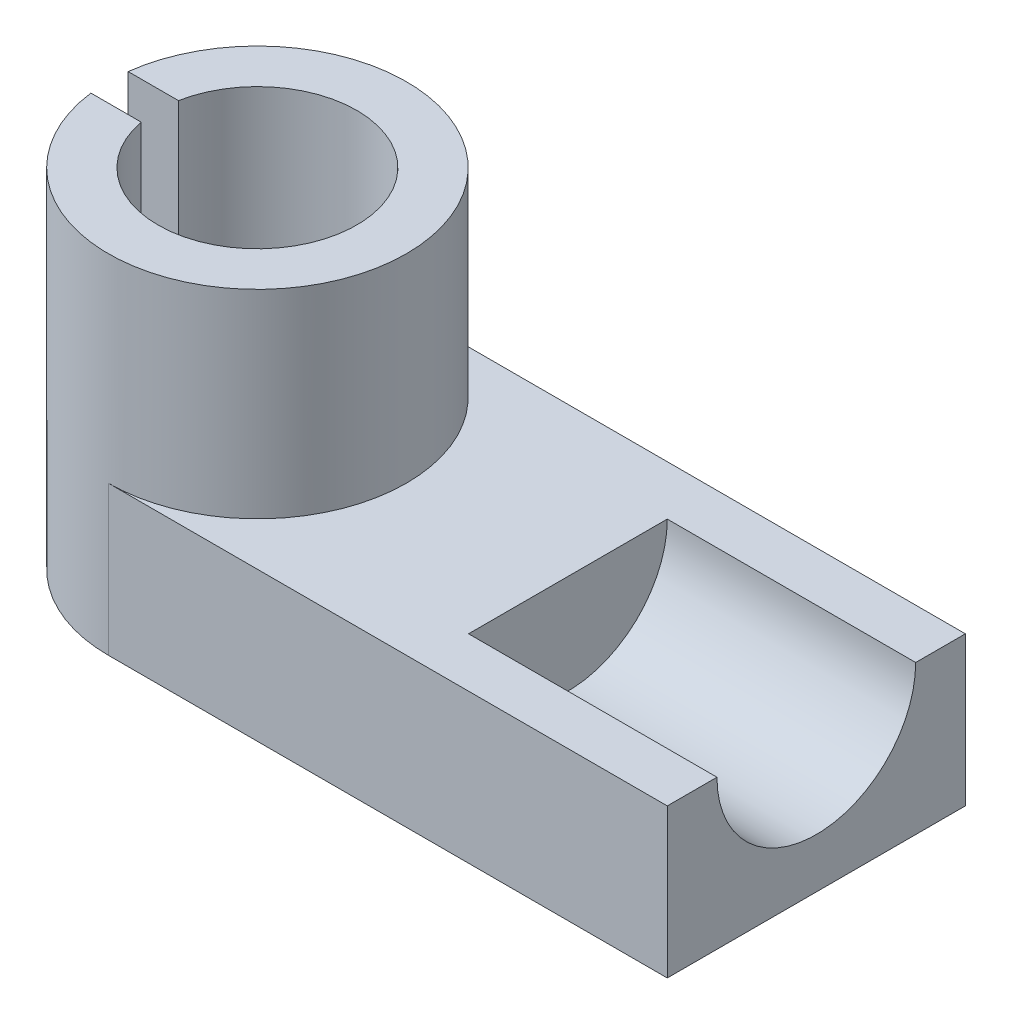
ISO-10303-21;
HEADER;
FILE_DESCRIPTION(('STEP AP214'),'2;1');
FILE_NAME('part.step','',(''),(''),'','','');
FILE_SCHEMA(('AUTOMOTIVE_DESIGN { 1 0 10303 214 1 1 1 1 }'));
ENDSEC;
DATA;
#1=APPLICATION_CONTEXT('core data for automotive mechanical design processes');
#2=APPLICATION_PROTOCOL_DEFINITION('international standard','automotive_design',2000,#1);
#3=PRODUCT_CONTEXT('',#1,'mechanical');
#4=PRODUCT('Part','Part','',(#3));
#5=PRODUCT_RELATED_PRODUCT_CATEGORY('part','',(#4));
#6=PRODUCT_DEFINITION_FORMATION('','',#4);
#7=PRODUCT_DEFINITION_CONTEXT('part definition',#1,'design');
#8=PRODUCT_DEFINITION('design','',#6,#7);
#9=PRODUCT_DEFINITION_SHAPE('','',#8);
#10=(LENGTH_UNIT() NAMED_UNIT(*) SI_UNIT(.MILLI.,.METRE.));
#11=(NAMED_UNIT(*) PLANE_ANGLE_UNIT() SI_UNIT($,.RADIAN.));
#12=(NAMED_UNIT(*) SI_UNIT($,.STERADIAN.) SOLID_ANGLE_UNIT());
#13=UNCERTAINTY_MEASURE_WITH_UNIT(LENGTH_MEASURE(1.E-05),#10,'distance_accuracy_value','');
#14=(GEOMETRIC_REPRESENTATION_CONTEXT(3) GLOBAL_UNCERTAINTY_ASSIGNED_CONTEXT((#13)) GLOBAL_UNIT_ASSIGNED_CONTEXT((#10,
#11,#12)) REPRESENTATION_CONTEXT('',''));
#15=CARTESIAN_POINT('',(0.,0.,0.));
#16=DIRECTION('',(0.,0.,1.));
#17=DIRECTION('',(1.,0.,0.));
#18=AXIS2_PLACEMENT_3D('',#15,#16,#17);
#19=CARTESIAN_POINT('',(0.,0.,0.));
#20=DIRECTION('',(0.,-1.,0.));
#21=DIRECTION('',(0.,0.,-1.));
#22=AXIS2_PLACEMENT_3D('',#19,#20,#21);
#23=PLANE('',#22);
#24=DIRECTION('',(1.,0.,0.));
#25=VECTOR('',#24,1.);
#26=CARTESIAN_POINT('',(-80.,0.,3.));
#27=LINE('',#26,#25);
#28=CARTESIAN_POINT('',(-68.8117617995813,0.,3.));
#29=VERTEX_POINT('',#28);
#30=CARTESIAN_POINT('',(-60.7162336455017,0.,3.));
#31=VERTEX_POINT('',#30);
#32=EDGE_CURVE('E300',#29,#31,#27,.T.);
#33=ORIENTED_EDGE('',*,*,#32,.T.);
#34=CARTESIAN_POINT('',(-45.,0.,0.));
#35=DIRECTION('',(0.,1.,0.));
#36=DIRECTION('',(0.,0.,1.));
#37=AXIS2_PLACEMENT_3D('',#34,#35,#36);
#38=CIRCLE('',#37,16.);
#39=CARTESIAN_POINT('',(-60.7162336455017,0.,-3.));
#40=VERTEX_POINT('',#39);
#41=EDGE_CURVE('E293',#31,#40,#38,.T.);
#42=ORIENTED_EDGE('',*,*,#41,.T.);
#43=DIRECTION('',(-1.,0.,0.));
#44=VECTOR('',#43,1.);
#45=CARTESIAN_POINT('',(-80.,0.,-3.));
#46=LINE('',#45,#44);
#47=CARTESIAN_POINT('',(-68.8117617995813,0.,-3.));
#48=VERTEX_POINT('',#47);
#49=EDGE_CURVE('E301',#40,#48,#46,.T.);
#50=ORIENTED_EDGE('',*,*,#49,.T.);
#51=CARTESIAN_POINT('',(-45.,0.,0.));
#52=DIRECTION('',(0.,1.,0.));
#53=DIRECTION('',(0.,0.,1.));
#54=AXIS2_PLACEMENT_3D('',#51,#52,#53);
#55=CIRCLE('',#54,24.);
#56=CARTESIAN_POINT('',(-45.,0.,-24.));
#57=VERTEX_POINT('',#56);
#58=EDGE_CURVE('E121',#57,#48,#55,.T.);
#59=ORIENTED_EDGE('',*,*,#58,.F.);
#60=DIRECTION('',(-1.,0.,0.));
#61=VECTOR('',#60,1.);
#62=CARTESIAN_POINT('',(-45.,0.,-24.));
#63=LINE('',#62,#61);
#64=CARTESIAN_POINT('',(45.,0.,-24.));
#65=VERTEX_POINT('',#64);
#66=EDGE_CURVE('E149',#65,#57,#63,.T.);
#67=ORIENTED_EDGE('',*,*,#66,.F.);
#68=DIRECTION('',(0.,0.,-1.));
#69=VECTOR('',#68,1.);
#70=CARTESIAN_POINT('',(45.,0.,24.));
#71=LINE('',#70,#69);
#72=CARTESIAN_POINT('',(45.,0.,24.));
#73=VERTEX_POINT('',#72);
#74=EDGE_CURVE('E135',#73,#65,#71,.T.);
#75=ORIENTED_EDGE('',*,*,#74,.F.);
#76=DIRECTION('',(1.,0.,0.));
#77=VECTOR('',#76,1.);
#78=CARTESIAN_POINT('',(-45.,0.,24.));
#79=LINE('',#78,#77);
#80=CARTESIAN_POINT('',(-45.,0.,24.));
#81=VERTEX_POINT('',#80);
#82=EDGE_CURVE('E152',#81,#73,#79,.T.);
#83=ORIENTED_EDGE('',*,*,#82,.F.);
#84=EDGE_CURVE('E298',#29,#81,#55,.T.);
#85=ORIENTED_EDGE('',*,*,#84,.F.);
#86=EDGE_LOOP('',(#33,#42,#50,#59,#67,#75,#83,#85));
#87=FACE_BOUND('',#86,.T.);
#88=ADVANCED_FACE('F33',(#87),#23,.T.);
#89=CARTESIAN_POINT('',(45.,24.,24.));
#90=DIRECTION('',(-1.,0.,0.));
#91=DIRECTION('',(0.,0.,1.));
#92=AXIS2_PLACEMENT_3D('',#89,#90,#91);
#93=PLANE('',#92);
#94=DIRECTION('',(0.,0.,-1.));
#95=VECTOR('',#94,1.);
#96=CARTESIAN_POINT('',(45.,24.,24.));
#97=LINE('',#96,#95);
#98=CARTESIAN_POINT('',(45.,24.,-16.));
#99=VERTEX_POINT('',#98);
#100=CARTESIAN_POINT('',(45.,24.,-24.));
#101=VERTEX_POINT('',#100);
#102=EDGE_CURVE('E141',#99,#101,#97,.T.);
#103=ORIENTED_EDGE('',*,*,#102,.F.);
#104=CARTESIAN_POINT('',(45.,24.,0.));
#105=DIRECTION('',(1.,0.,0.));
#106=DIRECTION('',(0.,0.,-1.));
#107=AXIS2_PLACEMENT_3D('',#104,#105,#106);
#108=CIRCLE('',#107,16.);
#109=CARTESIAN_POINT('',(45.,24.,16.));
#110=VERTEX_POINT('',#109);
#111=EDGE_CURVE('E128',#110,#99,#108,.T.);
#112=ORIENTED_EDGE('',*,*,#111,.F.);
#113=CARTESIAN_POINT('',(45.,24.,24.));
#114=VERTEX_POINT('',#113);
#115=EDGE_CURVE('E137',#114,#110,#97,.T.);
#116=ORIENTED_EDGE('',*,*,#115,.F.);
#117=DIRECTION('',(0.,-1.,0.));
#118=VECTOR('',#117,1.);
#119=CARTESIAN_POINT('',(45.,24.,24.));
#120=LINE('',#119,#118);
#121=EDGE_CURVE('E146',#114,#73,#120,.T.);
#122=ORIENTED_EDGE('',*,*,#121,.T.);
#123=ORIENTED_EDGE('',*,*,#74,.T.);
#124=DIRECTION('',(0.,-1.,0.));
#125=VECTOR('',#124,1.);
#126=CARTESIAN_POINT('',(45.,24.,-24.));
#127=LINE('',#126,#125);
#128=EDGE_CURVE('E161',#101,#65,#127,.T.);
#129=ORIENTED_EDGE('',*,*,#128,.F.);
#130=EDGE_LOOP('',(#103,#112,#116,#122,#123,#129));
#131=FACE_BOUND('',#130,.T.);
#132=ADVANCED_FACE('F35',(#131),#93,.F.);
#133=CARTESIAN_POINT('',(-45.,24.,-24.));
#134=DIRECTION('',(0.,0.,1.));
#135=DIRECTION('',(1.,0.,0.));
#136=AXIS2_PLACEMENT_3D('',#133,#134,#135);
#137=PLANE('',#136);
#138=ORIENTED_EDGE('',*,*,#66,.T.);
#139=DIRECTION('',(0.,-1.,0.));
#140=VECTOR('',#139,1.);
#141=CARTESIAN_POINT('',(-45.,24.,-24.));
#142=LINE('',#141,#140);
#143=CARTESIAN_POINT('',(-45.,24.,-24.));
#144=VERTEX_POINT('',#143);
#145=EDGE_CURVE('E159',#144,#57,#142,.T.);
#146=ORIENTED_EDGE('',*,*,#145,.F.);
#147=DIRECTION('',(-1.,0.,0.));
#148=VECTOR('',#147,1.);
#149=CARTESIAN_POINT('',(-45.,24.,-24.));
#150=LINE('',#149,#148);
#151=EDGE_CURVE('E140',#101,#144,#150,.T.);
#152=ORIENTED_EDGE('',*,*,#151,.F.);
#153=ORIENTED_EDGE('',*,*,#128,.T.);
#154=EDGE_LOOP('',(#138,#146,#152,#153));
#155=FACE_BOUND('',#154,.T.);
#156=ADVANCED_FACE('F185',(#155),#137,.F.);
#157=CARTESIAN_POINT('',(-45.,24.,24.));
#158=DIRECTION('',(0.,0.,-1.));
#159=DIRECTION('',(-1.,0.,0.));
#160=AXIS2_PLACEMENT_3D('',#157,#158,#159);
#161=PLANE('',#160);
#162=ORIENTED_EDGE('',*,*,#82,.T.);
#163=ORIENTED_EDGE('',*,*,#121,.F.);
#164=DIRECTION('',(1.,0.,0.));
#165=VECTOR('',#164,1.);
#166=CARTESIAN_POINT('',(-45.,24.,24.));
#167=LINE('',#166,#165);
#168=CARTESIAN_POINT('',(-45.,24.,24.));
#169=VERTEX_POINT('',#168);
#170=EDGE_CURVE('E144',#169,#114,#167,.T.);
#171=ORIENTED_EDGE('',*,*,#170,.F.);
#172=DIRECTION('',(0.,-1.,0.));
#173=VECTOR('',#172,1.);
#174=CARTESIAN_POINT('',(-45.,24.,24.));
#175=LINE('',#174,#173);
#176=EDGE_CURVE('E156',#169,#81,#175,.T.);
#177=ORIENTED_EDGE('',*,*,#176,.T.);
#178=EDGE_LOOP('',(#162,#163,#171,#177));
#179=FACE_BOUND('',#178,.T.);
#180=ADVANCED_FACE('F190',(#179),#161,.F.);
#181=CARTESIAN_POINT('',(0.,24.,0.));
#182=DIRECTION('',(0.,-1.,0.));
#183=DIRECTION('',(0.,0.,-1.));
#184=AXIS2_PLACEMENT_3D('',#181,#182,#183);
#185=PLANE('',#184);
#186=CARTESIAN_POINT('',(-45.,24.,0.));
#187=DIRECTION('',(0.,-1.,0.));
#188=DIRECTION('',(0.,0.,-1.));
#189=AXIS2_PLACEMENT_3D('',#186,#187,#188);
#190=CIRCLE('',#189,24.);
#191=EDGE_CURVE('E125',#169,#144,#190,.F.);
#192=ORIENTED_EDGE('',*,*,#191,.F.);
#193=ORIENTED_EDGE('',*,*,#170,.T.);
#194=ORIENTED_EDGE('',*,*,#115,.T.);
#195=DIRECTION('',(1.,0.,0.));
#196=VECTOR('',#195,1.);
#197=CARTESIAN_POINT('',(4.99999999999998,24.,16.));
#198=LINE('',#197,#196);
#199=CARTESIAN_POINT('',(4.99999999999998,24.,16.));
#200=VERTEX_POINT('',#199);
#201=EDGE_CURVE('E166',#110,#200,#198,.F.);
#202=ORIENTED_EDGE('',*,*,#201,.T.);
#203=DIRECTION('',(0.,0.,1.));
#204=VECTOR('',#203,1.);
#205=CARTESIAN_POINT('',(4.99999999999998,24.,0.));
#206=LINE('',#205,#204);
#207=CARTESIAN_POINT('',(4.99999999999998,24.,-16.));
#208=VERTEX_POINT('',#207);
#209=EDGE_CURVE('E164',#208,#200,#206,.T.);
#210=ORIENTED_EDGE('',*,*,#209,.F.);
#211=DIRECTION('',(1.,0.,0.));
#212=VECTOR('',#211,1.);
#213=CARTESIAN_POINT('',(4.99999999999998,24.,-16.));
#214=LINE('',#213,#212);
#215=EDGE_CURVE('E114',#208,#99,#214,.T.);
#216=ORIENTED_EDGE('',*,*,#215,.T.);
#217=ORIENTED_EDGE('',*,*,#102,.T.);
#218=ORIENTED_EDGE('',*,*,#151,.T.);
#219=EDGE_LOOP('',(#192,#193,#194,#202,#210,#216,#217,#218));
#220=FACE_BOUND('',#219,.T.);
#221=ADVANCED_FACE('F175',(#220),#185,.F.);
#222=CARTESIAN_POINT('',(4.99999999999998,24.,0.));
#223=DIRECTION('',(1.,0.,0.));
#224=DIRECTION('',(0.,0.,-1.));
#225=AXIS2_PLACEMENT_3D('',#222,#223,#224);
#226=CYLINDRICAL_SURFACE('',#225,16.);
#227=CARTESIAN_POINT('',(4.99999999999998,24.,0.));
#228=DIRECTION('',(1.,0.,0.));
#229=DIRECTION('',(0.,0.,-1.));
#230=AXIS2_PLACEMENT_3D('',#227,#228,#229);
#231=CIRCLE('',#230,16.);
#232=EDGE_CURVE('E133',#200,#208,#231,.T.);
#233=ORIENTED_EDGE('',*,*,#232,.F.);
#234=ORIENTED_EDGE('',*,*,#201,.F.);
#235=ORIENTED_EDGE('',*,*,#111,.T.);
#236=ORIENTED_EDGE('',*,*,#215,.F.);
#237=EDGE_LOOP('',(#233,#234,#235,#236));
#238=FACE_BOUND('',#237,.T.);
#239=ADVANCED_FACE('F192',(#238),#226,.F.);
#240=CARTESIAN_POINT('',(4.99999999999998,24.,0.));
#241=DIRECTION('',(1.,0.,0.));
#242=DIRECTION('',(0.,0.,-1.));
#243=AXIS2_PLACEMENT_3D('',#240,#241,#242);
#244=PLANE('',#243);
#245=ORIENTED_EDGE('',*,*,#209,.T.);
#246=ORIENTED_EDGE('',*,*,#232,.T.);
#247=EDGE_LOOP('',(#245,#246));
#248=FACE_BOUND('',#247,.T.);
#249=ADVANCED_FACE('F194',(#248),#244,.T.);
#250=CARTESIAN_POINT('',(-45.,56.,0.));
#251=DIRECTION('',(0.,-1.,0.));
#252=DIRECTION('',(0.,0.,-1.));
#253=AXIS2_PLACEMENT_3D('',#250,#251,#252);
#254=CYLINDRICAL_SURFACE('',#253,24.);
#255=CARTESIAN_POINT('',(-45.,56.,0.));
#256=DIRECTION('',(0.,1.,0.));
#257=DIRECTION('',(0.,0.,1.));
#258=AXIS2_PLACEMENT_3D('',#255,#256,#257);
#259=CIRCLE('',#258,24.);
#260=CARTESIAN_POINT('',(-68.8117617995813,56.,3.));
#261=VERTEX_POINT('',#260);
#262=CARTESIAN_POINT('',(-68.8117617995813,56.,-3.));
#263=VERTEX_POINT('',#262);
#264=EDGE_CURVE('E119',#261,#263,#259,.T.);
#265=ORIENTED_EDGE('',*,*,#264,.F.);
#266=DIRECTION('',(0.,-1.,0.));
#267=VECTOR('',#266,1.);
#268=CARTESIAN_POINT('',(-68.8117617995813,56.,3.));
#269=LINE('',#268,#267);
#270=EDGE_CURVE('E55',#261,#29,#269,.T.);
#271=ORIENTED_EDGE('',*,*,#270,.T.);
#272=ORIENTED_EDGE('',*,*,#84,.T.);
#273=ORIENTED_EDGE('',*,*,#176,.F.);
#274=ORIENTED_EDGE('',*,*,#191,.T.);
#275=ORIENTED_EDGE('',*,*,#145,.T.);
#276=ORIENTED_EDGE('',*,*,#58,.T.);
#277=DIRECTION('',(0.,-1.,0.));
#278=VECTOR('',#277,1.);
#279=CARTESIAN_POINT('',(-68.8117617995813,56.,-3.));
#280=LINE('',#279,#278);
#281=EDGE_CURVE('E108',#48,#263,#280,.F.);
#282=ORIENTED_EDGE('',*,*,#281,.T.);
#283=EDGE_LOOP('',(#265,#271,#272,#273,#274,#275,#276,#282));
#284=FACE_BOUND('',#283,.T.);
#285=ADVANCED_FACE('F118',(#284),#254,.T.);
#286=CARTESIAN_POINT('',(-45.,56.,0.));
#287=DIRECTION('',(0.,-1.,0.));
#288=DIRECTION('',(0.,0.,-1.));
#289=AXIS2_PLACEMENT_3D('',#286,#287,#288);
#290=CYLINDRICAL_SURFACE('',#289,16.);
#291=DIRECTION('',(0.,-1.,0.));
#292=VECTOR('',#291,1.);
#293=CARTESIAN_POINT('',(-60.7162336455017,56.,3.));
#294=LINE('',#293,#292);
#295=CARTESIAN_POINT('',(-60.7162336455017,56.,3.));
#296=VERTEX_POINT('',#295);
#297=EDGE_CURVE('E122',#296,#31,#294,.T.);
#298=ORIENTED_EDGE('',*,*,#297,.F.);
#299=CARTESIAN_POINT('',(-45.,56.,0.));
#300=DIRECTION('',(0.,1.,0.));
#301=DIRECTION('',(0.,0.,1.));
#302=AXIS2_PLACEMENT_3D('',#299,#300,#301);
#303=CIRCLE('',#302,16.);
#304=CARTESIAN_POINT('',(-60.7162336455017,56.,-3.));
#305=VERTEX_POINT('',#304);
#306=EDGE_CURVE('E126',#296,#305,#303,.T.);
#307=ORIENTED_EDGE('',*,*,#306,.T.);
#308=DIRECTION('',(0.,-1.,0.));
#309=VECTOR('',#308,1.);
#310=CARTESIAN_POINT('',(-60.7162336455017,56.,-3.));
#311=LINE('',#310,#309);
#312=EDGE_CURVE('E48',#40,#305,#311,.F.);
#313=ORIENTED_EDGE('',*,*,#312,.F.);
#314=ORIENTED_EDGE('',*,*,#41,.F.);
#315=EDGE_LOOP('',(#298,#307,#313,#314));
#316=FACE_BOUND('',#315,.T.);
#317=ADVANCED_FACE('F201',(#316),#290,.F.);
#318=CARTESIAN_POINT('',(-45.,56.,0.));
#319=DIRECTION('',(0.,1.,0.));
#320=DIRECTION('',(0.,0.,1.));
#321=AXIS2_PLACEMENT_3D('',#318,#319,#320);
#322=PLANE('',#321);
#323=DIRECTION('',(1.,0.,0.));
#324=VECTOR('',#323,1.);
#325=CARTESIAN_POINT('',(-45.,56.,3.));
#326=LINE('',#325,#324);
#327=EDGE_CURVE('E11',#261,#296,#326,.T.);
#328=ORIENTED_EDGE('',*,*,#327,.F.);
#329=ORIENTED_EDGE('',*,*,#264,.T.);
#330=DIRECTION('',(-1.,0.,0.));
#331=VECTOR('',#330,1.);
#332=CARTESIAN_POINT('',(-45.,56.,-3.));
#333=LINE('',#332,#331);
#334=EDGE_CURVE('E41',#305,#263,#333,.T.);
#335=ORIENTED_EDGE('',*,*,#334,.F.);
#336=ORIENTED_EDGE('',*,*,#306,.F.);
#337=EDGE_LOOP('',(#328,#329,#335,#336));
#338=FACE_BOUND('',#337,.T.);
#339=ADVANCED_FACE('F124',(#338),#322,.T.);
#340=CARTESIAN_POINT('',(-80.,0.,-3.));
#341=DIRECTION('',(0.,0.,-1.));
#342=DIRECTION('',(-1.,0.,0.));
#343=AXIS2_PLACEMENT_3D('',#340,#341,#342);
#344=PLANE('',#343);
#345=ORIENTED_EDGE('',*,*,#49,.F.);
#346=ORIENTED_EDGE('',*,*,#312,.T.);
#347=ORIENTED_EDGE('',*,*,#334,.T.);
#348=ORIENTED_EDGE('',*,*,#281,.F.);
#349=EDGE_LOOP('',(#345,#346,#347,#348));
#350=FACE_BOUND('',#349,.T.);
#351=ADVANCED_FACE('F107',(#350),#344,.F.);
#352=CARTESIAN_POINT('',(-80.,0.,3.));
#353=DIRECTION('',(0.,0.,1.));
#354=DIRECTION('',(1.,0.,0.));
#355=AXIS2_PLACEMENT_3D('',#352,#353,#354);
#356=PLANE('',#355);
#357=ORIENTED_EDGE('',*,*,#327,.T.);
#358=ORIENTED_EDGE('',*,*,#297,.T.);
#359=ORIENTED_EDGE('',*,*,#32,.F.);
#360=ORIENTED_EDGE('',*,*,#270,.F.);
#361=EDGE_LOOP('',(#357,#358,#359,#360));
#362=FACE_BOUND('',#361,.T.);
#363=ADVANCED_FACE('F278',(#362),#356,.F.);
#364=CLOSED_SHELL('',(#88,#132,#156,#180,#221,#239,#249,#285,#317,#339,#351,#363));
#365=MANIFOLD_SOLID_BREP('B2',#364);
#366=ADVANCED_BREP_SHAPE_REPRESENTATION('',(#18,#365),#14);
#367=SHAPE_DEFINITION_REPRESENTATION(#9,#366);
ENDSEC;
END-ISO-10303-21;
